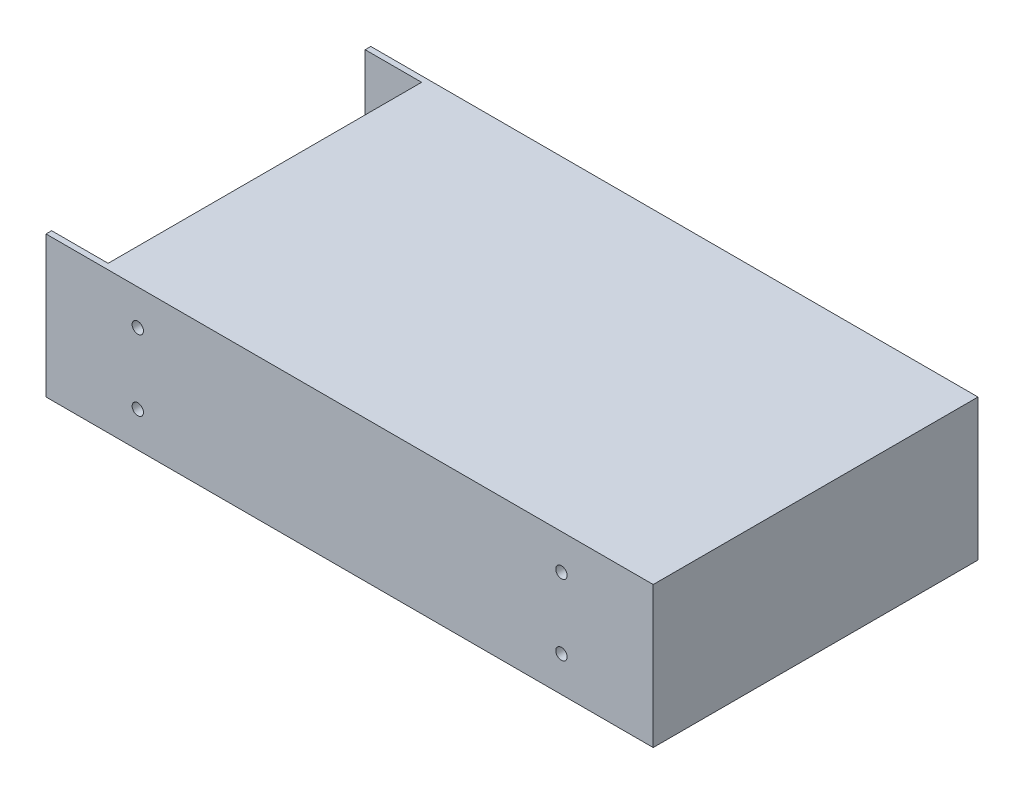
ISO-10303-21;
HEADER;
FILE_DESCRIPTION(('STEP AP214'),'2;1');
FILE_NAME('part.step','',(''),(''),'','','');
FILE_SCHEMA(('AUTOMOTIVE_DESIGN { 1 0 10303 214 1 1 1 1 }'));
ENDSEC;
DATA;
#1=APPLICATION_CONTEXT('core data for automotive mechanical design processes');
#2=APPLICATION_PROTOCOL_DEFINITION('international standard','automotive_design',2000,#1);
#3=PRODUCT_CONTEXT('',#1,'mechanical');
#4=PRODUCT('Part','Part','',(#3));
#5=PRODUCT_RELATED_PRODUCT_CATEGORY('part','',(#4));
#6=PRODUCT_DEFINITION_FORMATION('','',#4);
#7=PRODUCT_DEFINITION_CONTEXT('part definition',#1,'design');
#8=PRODUCT_DEFINITION('design','',#6,#7);
#9=PRODUCT_DEFINITION_SHAPE('','',#8);
#10=(LENGTH_UNIT() NAMED_UNIT(*) SI_UNIT(.MILLI.,.METRE.));
#11=(NAMED_UNIT(*) PLANE_ANGLE_UNIT() SI_UNIT($,.RADIAN.));
#12=(NAMED_UNIT(*) SI_UNIT($,.STERADIAN.) SOLID_ANGLE_UNIT());
#13=UNCERTAINTY_MEASURE_WITH_UNIT(LENGTH_MEASURE(1.E-05),#10,'distance_accuracy_value','');
#14=(GEOMETRIC_REPRESENTATION_CONTEXT(3) GLOBAL_UNCERTAINTY_ASSIGNED_CONTEXT((#13)) GLOBAL_UNIT_ASSIGNED_CONTEXT((#10,
#11,#12)) REPRESENTATION_CONTEXT('',''));
#15=CARTESIAN_POINT('',(0.,0.,0.));
#16=DIRECTION('',(0.,0.,1.));
#17=DIRECTION('',(1.,0.,0.));
#18=AXIS2_PLACEMENT_3D('',#15,#16,#17);
#19=CARTESIAN_POINT('',(107.5,50.,-57.5));
#20=DIRECTION('',(-1.,0.,0.));
#21=DIRECTION('',(0.,0.,1.));
#22=AXIS2_PLACEMENT_3D('',#19,#20,#21);
#23=PLANE('',#22);
#24=DIRECTION('',(0.,0.,-1.));
#25=VECTOR('',#24,1.);
#26=CARTESIAN_POINT('',(107.5,0.,-57.5));
#27=LINE('',#26,#25);
#28=CARTESIAN_POINT('',(107.5,0.,57.5));
#29=VERTEX_POINT('',#28);
#30=CARTESIAN_POINT('',(107.5,0.,-57.5));
#31=VERTEX_POINT('',#30);
#32=EDGE_CURVE('E142',#29,#31,#27,.T.);
#33=ORIENTED_EDGE('',*,*,#32,.T.);
#34=DIRECTION('',(0.,-1.,0.));
#35=VECTOR('',#34,1.);
#36=CARTESIAN_POINT('',(107.5,50.,-57.5));
#37=LINE('',#36,#35);
#38=CARTESIAN_POINT('',(107.5,50.,-57.5));
#39=VERTEX_POINT('',#38);
#40=EDGE_CURVE('E11',#39,#31,#37,.T.);
#41=ORIENTED_EDGE('',*,*,#40,.F.);
#42=DIRECTION('',(0.,0.,-1.));
#43=VECTOR('',#42,1.);
#44=CARTESIAN_POINT('',(107.5,50.,-57.5));
#45=LINE('',#44,#43);
#46=CARTESIAN_POINT('',(107.5,50.,57.5));
#47=VERTEX_POINT('',#46);
#48=EDGE_CURVE('E134',#47,#39,#45,.T.);
#49=ORIENTED_EDGE('',*,*,#48,.F.);
#50=DIRECTION('',(0.,-1.,0.));
#51=VECTOR('',#50,1.);
#52=CARTESIAN_POINT('',(107.5,50.,57.5));
#53=LINE('',#52,#51);
#54=EDGE_CURVE('E141',#47,#29,#53,.T.);
#55=ORIENTED_EDGE('',*,*,#54,.T.);
#56=EDGE_LOOP('',(#33,#41,#49,#55));
#57=FACE_BOUND('',#56,.T.);
#58=ADVANCED_FACE('F33',(#57),#23,.F.);
#59=CARTESIAN_POINT('',(-107.5,50.,-57.5));
#60=DIRECTION('',(0.,0.,1.));
#61=DIRECTION('',(1.,0.,0.));
#62=AXIS2_PLACEMENT_3D('',#59,#60,#61);
#63=PLANE('',#62);
#64=DIRECTION('',(-1.,0.,0.));
#65=VECTOR('',#64,1.);
#66=CARTESIAN_POINT('',(-107.5,0.,-57.5));
#67=LINE('',#66,#65);
#68=CARTESIAN_POINT('',(-107.5,0.,-57.5));
#69=VERTEX_POINT('',#68);
#70=EDGE_CURVE('E145',#31,#69,#67,.T.);
#71=ORIENTED_EDGE('',*,*,#70,.T.);
#72=DIRECTION('',(0.,-1.,0.));
#73=VECTOR('',#72,1.);
#74=CARTESIAN_POINT('',(-107.5,50.,-57.5));
#75=LINE('',#74,#73);
#76=CARTESIAN_POINT('',(-107.5,50.,-57.5));
#77=VERTEX_POINT('',#76);
#78=EDGE_CURVE('E40',#77,#69,#75,.T.);
#79=ORIENTED_EDGE('',*,*,#78,.F.);
#80=DIRECTION('',(-1.,0.,0.));
#81=VECTOR('',#80,1.);
#82=CARTESIAN_POINT('',(-107.5,50.,-57.5));
#83=LINE('',#82,#81);
#84=EDGE_CURVE('E84',#39,#77,#83,.T.);
#85=ORIENTED_EDGE('',*,*,#84,.F.);
#86=ORIENTED_EDGE('',*,*,#40,.T.);
#87=EDGE_LOOP('',(#71,#79,#85,#86));
#88=FACE_BOUND('',#87,.T.);
#89=ADVANCED_FACE('F172',(#88),#63,.F.);
#90=CARTESIAN_POINT('',(-107.5,50.,-57.5));
#91=DIRECTION('',(1.,0.,0.));
#92=DIRECTION('',(0.,0.,-1.));
#93=AXIS2_PLACEMENT_3D('',#90,#91,#92);
#94=PLANE('',#93);
#95=DIRECTION('',(0.,0.,1.));
#96=VECTOR('',#95,1.);
#97=CARTESIAN_POINT('',(-107.5,20.,55.5));
#98=LINE('',#97,#96);
#99=CARTESIAN_POINT('',(-107.5,20.,-55.5));
#100=VERTEX_POINT('',#99);
#101=CARTESIAN_POINT('',(-107.5,20.,55.5));
#102=VERTEX_POINT('',#101);
#103=EDGE_CURVE('E113',#100,#102,#98,.T.);
#104=ORIENTED_EDGE('',*,*,#103,.F.);
#105=DIRECTION('',(0.,1.,0.));
#106=VECTOR('',#105,1.);
#107=CARTESIAN_POINT('',(-107.5,20.,-55.5));
#108=LINE('',#107,#106);
#109=CARTESIAN_POINT('',(-107.5,50.,-55.5));
#110=VERTEX_POINT('',#109);
#111=EDGE_CURVE('E146',#100,#110,#108,.T.);
#112=ORIENTED_EDGE('',*,*,#111,.T.);
#113=DIRECTION('',(0.,0.,1.));
#114=VECTOR('',#113,1.);
#115=CARTESIAN_POINT('',(-107.5,50.,-57.5));
#116=LINE('',#115,#114);
#117=EDGE_CURVE('E137',#77,#110,#116,.T.);
#118=ORIENTED_EDGE('',*,*,#117,.F.);
#119=ORIENTED_EDGE('',*,*,#78,.T.);
#120=DIRECTION('',(0.,0.,1.));
#121=VECTOR('',#120,1.);
#122=CARTESIAN_POINT('',(-107.5,0.,-57.5));
#123=LINE('',#122,#121);
#124=CARTESIAN_POINT('',(-107.5,0.,57.5));
#125=VERTEX_POINT('',#124);
#126=EDGE_CURVE('E148',#69,#125,#123,.T.);
#127=ORIENTED_EDGE('',*,*,#126,.T.);
#128=DIRECTION('',(0.,-1.,0.));
#129=VECTOR('',#128,1.);
#130=CARTESIAN_POINT('',(-107.5,50.,57.5));
#131=LINE('',#130,#129);
#132=CARTESIAN_POINT('',(-107.5,50.,57.5));
#133=VERTEX_POINT('',#132);
#134=EDGE_CURVE('E152',#133,#125,#131,.T.);
#135=ORIENTED_EDGE('',*,*,#134,.F.);
#136=CARTESIAN_POINT('',(-107.5,50.,55.5));
#137=VERTEX_POINT('',#136);
#138=EDGE_CURVE('E127',#137,#133,#116,.T.);
#139=ORIENTED_EDGE('',*,*,#138,.F.);
#140=DIRECTION('',(0.,1.,0.));
#141=VECTOR('',#140,1.);
#142=CARTESIAN_POINT('',(-107.5,20.,55.5));
#143=LINE('',#142,#141);
#144=EDGE_CURVE('E47',#102,#137,#143,.T.);
#145=ORIENTED_EDGE('',*,*,#144,.F.);
#146=EDGE_LOOP('',(#104,#112,#118,#119,#127,#135,#139,#145));
#147=FACE_BOUND('',#146,.T.);
#148=ADVANCED_FACE('F125',(#147),#94,.F.);
#149=CARTESIAN_POINT('',(-107.5,50.,57.5));
#150=DIRECTION('',(0.,0.,-1.));
#151=DIRECTION('',(-1.,0.,0.));
#152=AXIS2_PLACEMENT_3D('',#149,#150,#151);
#153=PLANE('',#152);
#154=CARTESIAN_POINT('',(-75.,37.5,57.5));
#155=DIRECTION('',(0.,0.,1.));
#156=DIRECTION('',(1.,0.,0.));
#157=AXIS2_PLACEMENT_3D('',#154,#155,#156);
#158=CIRCLE('',#157,2.);
#159=CARTESIAN_POINT('',(-73.,37.5,57.5));
#160=VERTEX_POINT('',#159);
#161=EDGE_CURVE('E409',#160,#160,#158,.T.);
#162=ORIENTED_EDGE('',*,*,#161,.F.);
#163=EDGE_LOOP('',(#162));
#164=FACE_BOUND('',#163,.T.);
#165=CARTESIAN_POINT('',(75.,37.5,57.5));
#166=DIRECTION('',(0.,0.,1.));
#167=DIRECTION('',(1.,0.,0.));
#168=AXIS2_PLACEMENT_3D('',#165,#166,#167);
#169=CIRCLE('',#168,2.);
#170=CARTESIAN_POINT('',(77.,37.5,57.5));
#171=VERTEX_POINT('',#170);
#172=EDGE_CURVE('E420',#171,#171,#169,.T.);
#173=ORIENTED_EDGE('',*,*,#172,.F.);
#174=EDGE_LOOP('',(#173));
#175=FACE_BOUND('',#174,.T.);
#176=CARTESIAN_POINT('',(75.,12.5,57.5));
#177=DIRECTION('',(0.,0.,1.));
#178=DIRECTION('',(1.,0.,0.));
#179=AXIS2_PLACEMENT_3D('',#176,#177,#178);
#180=CIRCLE('',#179,2.);
#181=CARTESIAN_POINT('',(77.,12.5,57.5));
#182=VERTEX_POINT('',#181);
#183=EDGE_CURVE('E426',#182,#182,#180,.T.);
#184=ORIENTED_EDGE('',*,*,#183,.F.);
#185=EDGE_LOOP('',(#184));
#186=FACE_BOUND('',#185,.T.);
#187=CARTESIAN_POINT('',(-75.,12.5,57.5));
#188=DIRECTION('',(0.,0.,1.));
#189=DIRECTION('',(1.,0.,0.));
#190=AXIS2_PLACEMENT_3D('',#187,#188,#189);
#191=CIRCLE('',#190,2.);
#192=CARTESIAN_POINT('',(-73.,12.5,57.5));
#193=VERTEX_POINT('',#192);
#194=EDGE_CURVE('E408',#193,#193,#191,.T.);
#195=ORIENTED_EDGE('',*,*,#194,.F.);
#196=EDGE_LOOP('',(#195));
#197=FACE_BOUND('',#196,.T.);
#198=DIRECTION('',(1.,0.,0.));
#199=VECTOR('',#198,1.);
#200=CARTESIAN_POINT('',(-107.5,0.,57.5));
#201=LINE('',#200,#199);
#202=EDGE_CURVE('E77',#125,#29,#201,.T.);
#203=ORIENTED_EDGE('',*,*,#202,.T.);
#204=ORIENTED_EDGE('',*,*,#54,.F.);
#205=DIRECTION('',(1.,0.,0.));
#206=VECTOR('',#205,1.);
#207=CARTESIAN_POINT('',(-107.5,50.,57.5));
#208=LINE('',#207,#206);
#209=EDGE_CURVE('E56',#133,#47,#208,.T.);
#210=ORIENTED_EDGE('',*,*,#209,.F.);
#211=ORIENTED_EDGE('',*,*,#134,.T.);
#212=EDGE_LOOP('',(#203,#204,#210,#211));
#213=FACE_BOUND('',#212,.T.);
#214=ADVANCED_FACE('F162',(#164,#175,#186,#197,#213),#153,.F.);
#215=CARTESIAN_POINT('',(0.,50.,0.));
#216=DIRECTION('',(0.,1.,0.));
#217=DIRECTION('',(0.,0.,1.));
#218=AXIS2_PLACEMENT_3D('',#215,#216,#217);
#219=PLANE('',#218);
#220=DIRECTION('',(-1.,0.,0.));
#221=VECTOR('',#220,1.);
#222=CARTESIAN_POINT('',(-87.5,50.,-55.5));
#223=LINE('',#222,#221);
#224=CARTESIAN_POINT('',(-87.5,50.,-55.5));
#225=VERTEX_POINT('',#224);
#226=EDGE_CURVE('E122',#225,#110,#223,.T.);
#227=ORIENTED_EDGE('',*,*,#226,.F.);
#228=DIRECTION('',(0.,0.,-1.));
#229=VECTOR('',#228,1.);
#230=CARTESIAN_POINT('',(-87.5,50.,55.5));
#231=LINE('',#230,#229);
#232=CARTESIAN_POINT('',(-87.5,50.,55.5));
#233=VERTEX_POINT('',#232);
#234=EDGE_CURVE('E458',#233,#225,#231,.T.);
#235=ORIENTED_EDGE('',*,*,#234,.F.);
#236=DIRECTION('',(1.,0.,0.));
#237=VECTOR('',#236,1.);
#238=CARTESIAN_POINT('',(-87.5,50.,55.5));
#239=LINE('',#238,#237);
#240=EDGE_CURVE('E453',#137,#233,#239,.T.);
#241=ORIENTED_EDGE('',*,*,#240,.F.);
#242=ORIENTED_EDGE('',*,*,#138,.T.);
#243=ORIENTED_EDGE('',*,*,#209,.T.);
#244=ORIENTED_EDGE('',*,*,#48,.T.);
#245=ORIENTED_EDGE('',*,*,#84,.T.);
#246=ORIENTED_EDGE('',*,*,#117,.T.);
#247=EDGE_LOOP('',(#227,#235,#241,#242,#243,#244,#245,#246));
#248=FACE_BOUND('',#247,.T.);
#249=ADVANCED_FACE('F164',(#248),#219,.T.);
#250=CARTESIAN_POINT('',(0.,0.,0.));
#251=DIRECTION('',(0.,1.,0.));
#252=DIRECTION('',(0.,0.,1.));
#253=AXIS2_PLACEMENT_3D('',#250,#251,#252);
#254=PLANE('',#253);
#255=CARTESIAN_POINT('',(75.,0.,25.));
#256=DIRECTION('',(0.,-1.,0.));
#257=DIRECTION('',(0.,0.,-1.));
#258=AXIS2_PLACEMENT_3D('',#255,#256,#257);
#259=CIRCLE('',#258,2.);
#260=CARTESIAN_POINT('',(75.,0.,23.));
#261=VERTEX_POINT('',#260);
#262=EDGE_CURVE('E436',#261,#261,#259,.T.);
#263=ORIENTED_EDGE('',*,*,#262,.F.);
#264=EDGE_LOOP('',(#263));
#265=FACE_BOUND('',#264,.T.);
#266=CARTESIAN_POINT('',(75.,0.,-25.));
#267=DIRECTION('',(0.,-1.,0.));
#268=DIRECTION('',(0.,0.,-1.));
#269=AXIS2_PLACEMENT_3D('',#266,#267,#268);
#270=CIRCLE('',#269,2.);
#271=CARTESIAN_POINT('',(75.,0.,-27.));
#272=VERTEX_POINT('',#271);
#273=EDGE_CURVE('E442',#272,#272,#270,.T.);
#274=ORIENTED_EDGE('',*,*,#273,.F.);
#275=EDGE_LOOP('',(#274));
#276=FACE_BOUND('',#275,.T.);
#277=CARTESIAN_POINT('',(-75.,0.,-25.));
#278=DIRECTION('',(0.,-1.,0.));
#279=DIRECTION('',(0.,0.,-1.));
#280=AXIS2_PLACEMENT_3D('',#277,#278,#279);
#281=CIRCLE('',#280,2.);
#282=CARTESIAN_POINT('',(-75.,0.,-27.));
#283=VERTEX_POINT('',#282);
#284=EDGE_CURVE('E430',#283,#283,#281,.T.);
#285=ORIENTED_EDGE('',*,*,#284,.F.);
#286=EDGE_LOOP('',(#285));
#287=FACE_BOUND('',#286,.T.);
#288=CARTESIAN_POINT('',(-75.,0.,25.));
#289=DIRECTION('',(0.,-1.,0.));
#290=DIRECTION('',(0.,0.,-1.));
#291=AXIS2_PLACEMENT_3D('',#288,#289,#290);
#292=CIRCLE('',#291,2.);
#293=CARTESIAN_POINT('',(-75.,0.,23.));
#294=VERTEX_POINT('',#293);
#295=EDGE_CURVE('E435',#294,#294,#292,.T.);
#296=ORIENTED_EDGE('',*,*,#295,.F.);
#297=EDGE_LOOP('',(#296));
#298=FACE_BOUND('',#297,.T.);
#299=ORIENTED_EDGE('',*,*,#32,.F.);
#300=ORIENTED_EDGE('',*,*,#202,.F.);
#301=ORIENTED_EDGE('',*,*,#126,.F.);
#302=ORIENTED_EDGE('',*,*,#70,.F.);
#303=EDGE_LOOP('',(#299,#300,#301,#302));
#304=FACE_BOUND('',#303,.T.);
#305=ADVANCED_FACE('F158',(#265,#276,#287,#298,#304),#254,.F.);
#306=CARTESIAN_POINT('',(-87.5,20.,-55.5));
#307=DIRECTION('',(0.,0.,-1.));
#308=DIRECTION('',(-1.,0.,0.));
#309=AXIS2_PLACEMENT_3D('',#306,#307,#308);
#310=PLANE('',#309);
#311=ORIENTED_EDGE('',*,*,#226,.T.);
#312=ORIENTED_EDGE('',*,*,#111,.F.);
#313=DIRECTION('',(-1.,0.,0.));
#314=VECTOR('',#313,1.);
#315=CARTESIAN_POINT('',(-87.5,20.,-55.5));
#316=LINE('',#315,#314);
#317=CARTESIAN_POINT('',(-87.5,20.,-55.5));
#318=VERTEX_POINT('',#317);
#319=EDGE_CURVE('E119',#318,#100,#316,.T.);
#320=ORIENTED_EDGE('',*,*,#319,.F.);
#321=DIRECTION('',(0.,1.,0.));
#322=VECTOR('',#321,1.);
#323=CARTESIAN_POINT('',(-87.5,20.,-55.5));
#324=LINE('',#323,#322);
#325=EDGE_CURVE('E129',#318,#225,#324,.T.);
#326=ORIENTED_EDGE('',*,*,#325,.T.);
#327=EDGE_LOOP('',(#311,#312,#320,#326));
#328=FACE_BOUND('',#327,.T.);
#329=ADVANCED_FACE('F201',(#328),#310,.F.);
#330=CARTESIAN_POINT('',(-87.5,20.,55.5));
#331=DIRECTION('',(1.,0.,0.));
#332=DIRECTION('',(0.,0.,-1.));
#333=AXIS2_PLACEMENT_3D('',#330,#331,#332);
#334=PLANE('',#333);
#335=ORIENTED_EDGE('',*,*,#234,.T.);
#336=ORIENTED_EDGE('',*,*,#325,.F.);
#337=DIRECTION('',(0.,0.,-1.));
#338=VECTOR('',#337,1.);
#339=CARTESIAN_POINT('',(-87.5,20.,55.5));
#340=LINE('',#339,#338);
#341=CARTESIAN_POINT('',(-87.5,20.,55.5));
#342=VERTEX_POINT('',#341);
#343=EDGE_CURVE('E112',#342,#318,#340,.T.);
#344=ORIENTED_EDGE('',*,*,#343,.F.);
#345=DIRECTION('',(0.,1.,0.));
#346=VECTOR('',#345,1.);
#347=CARTESIAN_POINT('',(-87.5,20.,55.5));
#348=LINE('',#347,#346);
#349=EDGE_CURVE('E108',#342,#233,#348,.T.);
#350=ORIENTED_EDGE('',*,*,#349,.T.);
#351=EDGE_LOOP('',(#335,#336,#344,#350));
#352=FACE_BOUND('',#351,.T.);
#353=ADVANCED_FACE('F206',(#352),#334,.F.);
#354=CARTESIAN_POINT('',(-87.5,20.,55.5));
#355=DIRECTION('',(0.,0.,1.));
#356=DIRECTION('',(1.,0.,0.));
#357=AXIS2_PLACEMENT_3D('',#354,#355,#356);
#358=PLANE('',#357);
#359=ORIENTED_EDGE('',*,*,#240,.T.);
#360=ORIENTED_EDGE('',*,*,#349,.F.);
#361=DIRECTION('',(1.,0.,0.));
#362=VECTOR('',#361,1.);
#363=CARTESIAN_POINT('',(-87.5,20.,55.5));
#364=LINE('',#363,#362);
#365=EDGE_CURVE('E105',#102,#342,#364,.T.);
#366=ORIENTED_EDGE('',*,*,#365,.F.);
#367=ORIENTED_EDGE('',*,*,#144,.T.);
#368=EDGE_LOOP('',(#359,#360,#366,#367));
#369=FACE_BOUND('',#368,.T.);
#370=ADVANCED_FACE('F107',(#369),#358,.F.);
#371=CARTESIAN_POINT('',(0.,20.,0.));
#372=DIRECTION('',(0.,1.,0.));
#373=DIRECTION('',(0.,0.,1.));
#374=AXIS2_PLACEMENT_3D('',#371,#372,#373);
#375=PLANE('',#374);
#376=ORIENTED_EDGE('',*,*,#103,.T.);
#377=ORIENTED_EDGE('',*,*,#365,.T.);
#378=ORIENTED_EDGE('',*,*,#343,.T.);
#379=ORIENTED_EDGE('',*,*,#319,.T.);
#380=EDGE_LOOP('',(#376,#377,#378,#379));
#381=FACE_BOUND('',#380,.T.);
#382=ADVANCED_FACE('F117',(#381),#375,.T.);
#383=CARTESIAN_POINT('',(-75.,5.,25.));
#384=DIRECTION('',(0.,-1.,0.));
#385=DIRECTION('',(0.,0.,-1.));
#386=AXIS2_PLACEMENT_3D('',#383,#384,#385);
#387=CYLINDRICAL_SURFACE('',#386,2.);
#388=CARTESIAN_POINT('',(-75.,5.,25.));
#389=DIRECTION('',(0.,-1.,0.));
#390=DIRECTION('',(0.,0.,-1.));
#391=AXIS2_PLACEMENT_3D('',#388,#389,#390);
#392=CIRCLE('',#391,2.);
#393=CARTESIAN_POINT('',(-75.,5.,23.));
#394=VERTEX_POINT('',#393);
#395=EDGE_CURVE('E450',#394,#394,#392,.T.);
#396=ORIENTED_EDGE('',*,*,#395,.F.);
#397=EDGE_LOOP('',(#396));
#398=FACE_BOUND('',#397,.T.);
#399=ORIENTED_EDGE('',*,*,#295,.T.);
#400=EDGE_LOOP('',(#399));
#401=FACE_BOUND('',#400,.T.);
#402=ADVANCED_FACE('F233',(#398,#401),#387,.F.);
#403=CARTESIAN_POINT('',(-75.,5.,25.));
#404=DIRECTION('',(0.,-1.,0.));
#405=DIRECTION('',(0.,0.,-1.));
#406=AXIS2_PLACEMENT_3D('',#403,#404,#405);
#407=PLANE('',#406);
#408=ORIENTED_EDGE('',*,*,#395,.T.);
#409=EDGE_LOOP('',(#408));
#410=FACE_BOUND('',#409,.T.);
#411=ADVANCED_FACE('F248',(#410),#407,.T.);
#412=CARTESIAN_POINT('',(-75.,5.,-25.));
#413=DIRECTION('',(0.,-1.,0.));
#414=DIRECTION('',(0.,0.,-1.));
#415=AXIS2_PLACEMENT_3D('',#412,#413,#414);
#416=CYLINDRICAL_SURFACE('',#415,2.);
#417=CARTESIAN_POINT('',(-75.,5.,-25.));
#418=DIRECTION('',(0.,-1.,0.));
#419=DIRECTION('',(0.,0.,-1.));
#420=AXIS2_PLACEMENT_3D('',#417,#418,#419);
#421=CIRCLE('',#420,2.);
#422=CARTESIAN_POINT('',(-75.,5.,-27.));
#423=VERTEX_POINT('',#422);
#424=EDGE_CURVE('E445',#423,#423,#421,.T.);
#425=ORIENTED_EDGE('',*,*,#424,.F.);
#426=EDGE_LOOP('',(#425));
#427=FACE_BOUND('',#426,.T.);
#428=ORIENTED_EDGE('',*,*,#284,.T.);
#429=EDGE_LOOP('',(#428));
#430=FACE_BOUND('',#429,.T.);
#431=ADVANCED_FACE('F258',(#427,#430),#416,.F.);
#432=CARTESIAN_POINT('',(-75.,5.,-25.));
#433=DIRECTION('',(0.,-1.,0.));
#434=DIRECTION('',(0.,0.,-1.));
#435=AXIS2_PLACEMENT_3D('',#432,#433,#434);
#436=PLANE('',#435);
#437=ORIENTED_EDGE('',*,*,#424,.T.);
#438=EDGE_LOOP('',(#437));
#439=FACE_BOUND('',#438,.T.);
#440=ADVANCED_FACE('F268',(#439),#436,.T.);
#441=CARTESIAN_POINT('',(75.,5.,-25.));
#442=DIRECTION('',(0.,-1.,0.));
#443=DIRECTION('',(0.,0.,-1.));
#444=AXIS2_PLACEMENT_3D('',#441,#442,#443);
#445=CYLINDRICAL_SURFACE('',#444,2.);
#446=CARTESIAN_POINT('',(75.,5.,-25.));
#447=DIRECTION('',(0.,-1.,0.));
#448=DIRECTION('',(0.,0.,-1.));
#449=AXIS2_PLACEMENT_3D('',#446,#447,#448);
#450=CIRCLE('',#449,2.);
#451=CARTESIAN_POINT('',(75.,5.,-27.));
#452=VERTEX_POINT('',#451);
#453=EDGE_CURVE('E439',#452,#452,#450,.T.);
#454=ORIENTED_EDGE('',*,*,#453,.F.);
#455=EDGE_LOOP('',(#454));
#456=FACE_BOUND('',#455,.T.);
#457=ORIENTED_EDGE('',*,*,#273,.T.);
#458=EDGE_LOOP('',(#457));
#459=FACE_BOUND('',#458,.T.);
#460=ADVANCED_FACE('F278',(#456,#459),#445,.F.);
#461=CARTESIAN_POINT('',(75.,5.,-25.));
#462=DIRECTION('',(0.,-1.,0.));
#463=DIRECTION('',(0.,0.,-1.));
#464=AXIS2_PLACEMENT_3D('',#461,#462,#463);
#465=PLANE('',#464);
#466=ORIENTED_EDGE('',*,*,#453,.T.);
#467=EDGE_LOOP('',(#466));
#468=FACE_BOUND('',#467,.T.);
#469=ADVANCED_FACE('F288',(#468),#465,.T.);
#470=CARTESIAN_POINT('',(75.,5.,25.));
#471=DIRECTION('',(0.,-1.,0.));
#472=DIRECTION('',(0.,0.,-1.));
#473=AXIS2_PLACEMENT_3D('',#470,#471,#472);
#474=CYLINDRICAL_SURFACE('',#473,2.);
#475=CARTESIAN_POINT('',(75.,5.,25.));
#476=DIRECTION('',(0.,-1.,0.));
#477=DIRECTION('',(0.,0.,-1.));
#478=AXIS2_PLACEMENT_3D('',#475,#476,#477);
#479=CIRCLE('',#478,2.);
#480=CARTESIAN_POINT('',(75.,5.,23.));
#481=VERTEX_POINT('',#480);
#482=EDGE_CURVE('E432',#481,#481,#479,.T.);
#483=ORIENTED_EDGE('',*,*,#482,.F.);
#484=EDGE_LOOP('',(#483));
#485=FACE_BOUND('',#484,.T.);
#486=ORIENTED_EDGE('',*,*,#262,.T.);
#487=EDGE_LOOP('',(#486));
#488=FACE_BOUND('',#487,.T.);
#489=ADVANCED_FACE('F298',(#485,#488),#474,.F.);
#490=CARTESIAN_POINT('',(75.,5.,25.));
#491=DIRECTION('',(0.,-1.,0.));
#492=DIRECTION('',(0.,0.,-1.));
#493=AXIS2_PLACEMENT_3D('',#490,#491,#492);
#494=PLANE('',#493);
#495=ORIENTED_EDGE('',*,*,#482,.T.);
#496=EDGE_LOOP('',(#495));
#497=FACE_BOUND('',#496,.T.);
#498=ADVANCED_FACE('F308',(#497),#494,.T.);
#499=CARTESIAN_POINT('',(-75.,12.5,54.5));
#500=DIRECTION('',(0.,0.,1.));
#501=DIRECTION('',(1.,0.,0.));
#502=AXIS2_PLACEMENT_3D('',#499,#500,#501);
#503=CYLINDRICAL_SURFACE('',#502,2.);
#504=CARTESIAN_POINT('',(-75.,12.5,54.5));
#505=DIRECTION('',(0.,0.,1.));
#506=DIRECTION('',(1.,0.,0.));
#507=AXIS2_PLACEMENT_3D('',#504,#505,#506);
#508=CIRCLE('',#507,2.);
#509=CARTESIAN_POINT('',(-73.,12.5,54.5));
#510=VERTEX_POINT('',#509);
#511=EDGE_CURVE('E412',#510,#510,#508,.T.);
#512=ORIENTED_EDGE('',*,*,#511,.F.);
#513=EDGE_LOOP('',(#512));
#514=FACE_BOUND('',#513,.T.);
#515=ORIENTED_EDGE('',*,*,#194,.T.);
#516=EDGE_LOOP('',(#515));
#517=FACE_BOUND('',#516,.T.);
#518=ADVANCED_FACE('F317',(#514,#517),#503,.F.);
#519=CARTESIAN_POINT('',(-75.,12.5,54.5));
#520=DIRECTION('',(0.,0.,1.));
#521=DIRECTION('',(1.,0.,0.));
#522=AXIS2_PLACEMENT_3D('',#519,#520,#521);
#523=PLANE('',#522);
#524=ORIENTED_EDGE('',*,*,#511,.T.);
#525=EDGE_LOOP('',(#524));
#526=FACE_BOUND('',#525,.T.);
#527=ADVANCED_FACE('F331',(#526),#523,.T.);
#528=CARTESIAN_POINT('',(75.,12.5,54.5));
#529=DIRECTION('',(0.,0.,1.));
#530=DIRECTION('',(1.,0.,0.));
#531=AXIS2_PLACEMENT_3D('',#528,#529,#530);
#532=CYLINDRICAL_SURFACE('',#531,2.);
#533=CARTESIAN_POINT('',(75.,12.5,54.5));
#534=DIRECTION('',(0.,0.,1.));
#535=DIRECTION('',(1.,0.,0.));
#536=AXIS2_PLACEMENT_3D('',#533,#534,#535);
#537=CIRCLE('',#536,2.);
#538=CARTESIAN_POINT('',(77.,12.5,54.5));
#539=VERTEX_POINT('',#538);
#540=EDGE_CURVE('E423',#539,#539,#537,.T.);
#541=ORIENTED_EDGE('',*,*,#540,.F.);
#542=EDGE_LOOP('',(#541));
#543=FACE_BOUND('',#542,.T.);
#544=ORIENTED_EDGE('',*,*,#183,.T.);
#545=EDGE_LOOP('',(#544));
#546=FACE_BOUND('',#545,.T.);
#547=ADVANCED_FACE('F341',(#543,#546),#532,.F.);
#548=CARTESIAN_POINT('',(75.,12.5,54.5));
#549=DIRECTION('',(0.,0.,1.));
#550=DIRECTION('',(1.,0.,0.));
#551=AXIS2_PLACEMENT_3D('',#548,#549,#550);
#552=PLANE('',#551);
#553=ORIENTED_EDGE('',*,*,#540,.T.);
#554=EDGE_LOOP('',(#553));
#555=FACE_BOUND('',#554,.T.);
#556=ADVANCED_FACE('F351',(#555),#552,.T.);
#557=CARTESIAN_POINT('',(75.,37.5,54.5));
#558=DIRECTION('',(0.,0.,1.));
#559=DIRECTION('',(1.,0.,0.));
#560=AXIS2_PLACEMENT_3D('',#557,#558,#559);
#561=CYLINDRICAL_SURFACE('',#560,2.);
#562=CARTESIAN_POINT('',(75.,37.5,54.5));
#563=DIRECTION('',(0.,0.,1.));
#564=DIRECTION('',(1.,0.,0.));
#565=AXIS2_PLACEMENT_3D('',#562,#563,#564);
#566=CIRCLE('',#565,2.);
#567=CARTESIAN_POINT('',(77.,37.5,54.5));
#568=VERTEX_POINT('',#567);
#569=EDGE_CURVE('E415',#568,#568,#566,.T.);
#570=ORIENTED_EDGE('',*,*,#569,.F.);
#571=EDGE_LOOP('',(#570));
#572=FACE_BOUND('',#571,.T.);
#573=ORIENTED_EDGE('',*,*,#172,.T.);
#574=EDGE_LOOP('',(#573));
#575=FACE_BOUND('',#574,.T.);
#576=ADVANCED_FACE('F361',(#572,#575),#561,.F.);
#577=CARTESIAN_POINT('',(75.,37.5,54.5));
#578=DIRECTION('',(0.,0.,1.));
#579=DIRECTION('',(1.,0.,0.));
#580=AXIS2_PLACEMENT_3D('',#577,#578,#579);
#581=PLANE('',#580);
#582=ORIENTED_EDGE('',*,*,#569,.T.);
#583=EDGE_LOOP('',(#582));
#584=FACE_BOUND('',#583,.T.);
#585=ADVANCED_FACE('F371',(#584),#581,.T.);
#586=CARTESIAN_POINT('',(-75.,37.5,54.5));
#587=DIRECTION('',(0.,0.,1.));
#588=DIRECTION('',(1.,0.,0.));
#589=AXIS2_PLACEMENT_3D('',#586,#587,#588);
#590=CYLINDRICAL_SURFACE('',#589,2.);
#591=CARTESIAN_POINT('',(-75.,37.5,54.5));
#592=DIRECTION('',(0.,0.,1.));
#593=DIRECTION('',(1.,0.,0.));
#594=AXIS2_PLACEMENT_3D('',#591,#592,#593);
#595=CIRCLE('',#594,2.);
#596=CARTESIAN_POINT('',(-73.,37.5,54.5));
#597=VERTEX_POINT('',#596);
#598=EDGE_CURVE('E407',#597,#597,#595,.T.);
#599=ORIENTED_EDGE('',*,*,#598,.F.);
#600=EDGE_LOOP('',(#599));
#601=FACE_BOUND('',#600,.T.);
#602=ORIENTED_EDGE('',*,*,#161,.T.);
#603=EDGE_LOOP('',(#602));
#604=FACE_BOUND('',#603,.T.);
#605=ADVANCED_FACE('F381',(#601,#604),#590,.F.);
#606=CARTESIAN_POINT('',(-75.,37.5,54.5));
#607=DIRECTION('',(0.,0.,1.));
#608=DIRECTION('',(1.,0.,0.));
#609=AXIS2_PLACEMENT_3D('',#606,#607,#608);
#610=PLANE('',#609);
#611=ORIENTED_EDGE('',*,*,#598,.T.);
#612=EDGE_LOOP('',(#611));
#613=FACE_BOUND('',#612,.T.);
#614=ADVANCED_FACE('F391',(#613),#610,.T.);
#615=CLOSED_SHELL('',(#58,#89,#148,#214,#249,#305,#329,#353,#370,#382,#402,#411,#431,#440,#460,
#469,#489,#498,#518,#527,#547,#556,#576,#585,#605,#614));
#616=MANIFOLD_SOLID_BREP('B2',#615);
#617=ADVANCED_BREP_SHAPE_REPRESENTATION('',(#18,#616),#14);
#618=SHAPE_DEFINITION_REPRESENTATION(#9,#617);
ENDSEC;
END-ISO-10303-21;
